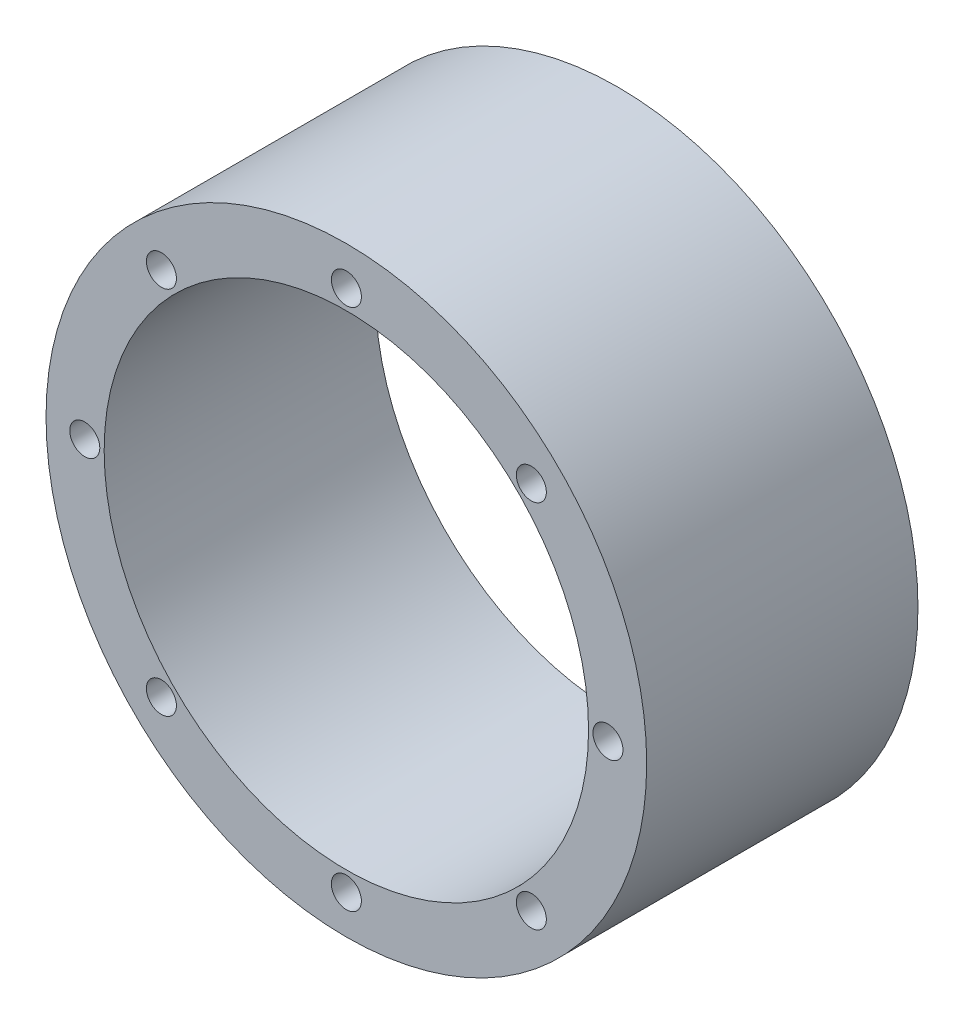
ISO-10303-21;
HEADER;
FILE_DESCRIPTION(('STEP AP214'),'2;1');
FILE_NAME('part.step','',(''),(''),'','','');
FILE_SCHEMA(('AUTOMOTIVE_DESIGN { 1 0 10303 214 1 1 1 1 }'));
ENDSEC;
DATA;
#1=APPLICATION_CONTEXT('core data for automotive mechanical design processes');
#2=APPLICATION_PROTOCOL_DEFINITION('international standard','automotive_design',2000,#1);
#3=PRODUCT_CONTEXT('',#1,'mechanical');
#4=PRODUCT('Part','Part','',(#3));
#5=PRODUCT_RELATED_PRODUCT_CATEGORY('part','',(#4));
#6=PRODUCT_DEFINITION_FORMATION('','',#4);
#7=PRODUCT_DEFINITION_CONTEXT('part definition',#1,'design');
#8=PRODUCT_DEFINITION('design','',#6,#7);
#9=PRODUCT_DEFINITION_SHAPE('','',#8);
#10=(LENGTH_UNIT() NAMED_UNIT(*) SI_UNIT(.MILLI.,.METRE.));
#11=(NAMED_UNIT(*) PLANE_ANGLE_UNIT() SI_UNIT($,.RADIAN.));
#12=(NAMED_UNIT(*) SI_UNIT($,.STERADIAN.) SOLID_ANGLE_UNIT());
#13=UNCERTAINTY_MEASURE_WITH_UNIT(LENGTH_MEASURE(1.E-05),#10,'distance_accuracy_value','');
#14=(GEOMETRIC_REPRESENTATION_CONTEXT(3) GLOBAL_UNCERTAINTY_ASSIGNED_CONTEXT((#13)) GLOBAL_UNIT_ASSIGNED_CONTEXT((#10,
#11,#12)) REPRESENTATION_CONTEXT('',''));
#15=CARTESIAN_POINT('',(0.,0.,0.));
#16=DIRECTION('',(0.,0.,1.));
#17=DIRECTION('',(1.,0.,0.));
#18=AXIS2_PLACEMENT_3D('',#15,#16,#17);
#19=CARTESIAN_POINT('',(0.,0.,28.));
#20=DIRECTION('',(0.,0.,1.));
#21=DIRECTION('',(1.,0.,0.));
#22=AXIS2_PLACEMENT_3D('',#19,#20,#21);
#23=PLANE('',#22);
#24=CARTESIAN_POINT('',(-2.82809988446294E-13,-27.,28.));
#25=DIRECTION('',(0.,0.,1.));
#26=DIRECTION('',(1.,0.,0.));
#27=AXIS2_PLACEMENT_3D('',#24,#25,#26);
#28=CIRCLE('',#27,1.55);
#29=CARTESIAN_POINT('',(1.54999999999971,-27.,28.));
#30=VERTEX_POINT('',#29);
#31=EDGE_CURVE('E86',#30,#30,#28,.T.);
#32=ORIENTED_EDGE('',*,*,#31,.F.);
#33=EDGE_LOOP('',(#32));
#34=FACE_BOUND('',#33,.T.);
#35=CARTESIAN_POINT('',(27.,-1.88539992297529E-13,28.));
#36=DIRECTION('',(0.,0.,1.));
#37=DIRECTION('',(1.,0.,0.));
#38=AXIS2_PLACEMENT_3D('',#35,#36,#37);
#39=CIRCLE('',#38,1.55);
#40=CARTESIAN_POINT('',(28.55,-1.88539992297529E-13,28.));
#41=VERTEX_POINT('',#40);
#42=EDGE_CURVE('E74',#41,#41,#39,.T.);
#43=ORIENTED_EDGE('',*,*,#42,.F.);
#44=EDGE_LOOP('',(#43));
#45=FACE_BOUND('',#44,.T.);
#46=CARTESIAN_POINT('',(0.,27.,28.));
#47=DIRECTION('',(0.,0.,1.));
#48=DIRECTION('',(1.,0.,0.));
#49=AXIS2_PLACEMENT_3D('',#46,#47,#48);
#50=CIRCLE('',#49,1.55);
#51=CARTESIAN_POINT('',(1.55000000000009,27.,28.));
#52=VERTEX_POINT('',#51);
#53=EDGE_CURVE('E62',#52,#52,#50,.T.);
#54=ORIENTED_EDGE('',*,*,#53,.F.);
#55=EDGE_LOOP('',(#54));
#56=FACE_BOUND('',#55,.T.);
#57=CARTESIAN_POINT('',(0.,0.,28.));
#58=DIRECTION('',(0.,0.,1.));
#59=DIRECTION('',(1.,0.,0.));
#60=AXIS2_PLACEMENT_3D('',#57,#58,#59);
#61=CIRCLE('',#60,25.);
#62=CARTESIAN_POINT('',(25.,0.,28.));
#63=VERTEX_POINT('',#62);
#64=EDGE_CURVE('E50',#63,#63,#61,.T.);
#65=ORIENTED_EDGE('',*,*,#64,.F.);
#66=EDGE_LOOP('',(#65));
#67=FACE_BOUND('',#66,.T.);
#68=CARTESIAN_POINT('',(0.,0.,28.));
#69=DIRECTION('',(0.,0.,1.));
#70=DIRECTION('',(1.,0.,0.));
#71=AXIS2_PLACEMENT_3D('',#68,#69,#70);
#72=CIRCLE('',#71,31.);
#73=CARTESIAN_POINT('',(31.,0.,28.));
#74=VERTEX_POINT('',#73);
#75=EDGE_CURVE('E10',#74,#74,#72,.T.);
#76=ORIENTED_EDGE('',*,*,#75,.T.);
#77=EDGE_LOOP('',(#76));
#78=FACE_BOUND('',#77,.T.);
#79=CARTESIAN_POINT('',(-27.,0.,28.));
#80=DIRECTION('',(0.,0.,1.));
#81=DIRECTION('',(1.,0.,0.));
#82=AXIS2_PLACEMENT_3D('',#79,#80,#81);
#83=CIRCLE('',#82,1.55);
#84=CARTESIAN_POINT('',(-25.45,0.,28.));
#85=VERTEX_POINT('',#84);
#86=EDGE_CURVE('E45',#85,#85,#83,.T.);
#87=ORIENTED_EDGE('',*,*,#86,.F.);
#88=EDGE_LOOP('',(#87));
#89=FACE_BOUND('',#88,.T.);
#90=CARTESIAN_POINT('',(-19.0918830920367,19.0918830920368,28.));
#91=DIRECTION('',(0.,0.,1.));
#92=DIRECTION('',(1.,0.,0.));
#93=AXIS2_PLACEMENT_3D('',#90,#91,#92);
#94=CIRCLE('',#93,1.54999999999999);
#95=CARTESIAN_POINT('',(-17.5418830920368,19.0918830920368,28.));
#96=VERTEX_POINT('',#95);
#97=EDGE_CURVE('E56',#96,#96,#94,.T.);
#98=ORIENTED_EDGE('',*,*,#97,.F.);
#99=EDGE_LOOP('',(#98));
#100=FACE_BOUND('',#99,.T.);
#101=CARTESIAN_POINT('',(19.0918830920369,19.0918830920367,28.));
#102=DIRECTION('',(0.,0.,1.));
#103=DIRECTION('',(1.,0.,0.));
#104=AXIS2_PLACEMENT_3D('',#101,#102,#103);
#105=CIRCLE('',#104,1.55);
#106=CARTESIAN_POINT('',(20.6418830920369,19.0918830920367,28.));
#107=VERTEX_POINT('',#106);
#108=EDGE_CURVE('E68',#107,#107,#105,.T.);
#109=ORIENTED_EDGE('',*,*,#108,.F.);
#110=EDGE_LOOP('',(#109));
#111=FACE_BOUND('',#110,.T.);
#112=CARTESIAN_POINT('',(19.0918830920366,-19.0918830920369,28.));
#113=DIRECTION('',(0.,0.,1.));
#114=DIRECTION('',(1.,0.,0.));
#115=AXIS2_PLACEMENT_3D('',#112,#113,#114);
#116=CIRCLE('',#115,1.54999999999999);
#117=CARTESIAN_POINT('',(20.6418830920366,-19.0918830920369,28.));
#118=VERTEX_POINT('',#117);
#119=EDGE_CURVE('E80',#118,#118,#116,.T.);
#120=ORIENTED_EDGE('',*,*,#119,.F.);
#121=EDGE_LOOP('',(#120));
#122=FACE_BOUND('',#121,.T.);
#123=CARTESIAN_POINT('',(-19.091883092037,-19.0918830920366,28.));
#124=DIRECTION('',(0.,0.,1.));
#125=DIRECTION('',(1.,0.,0.));
#126=AXIS2_PLACEMENT_3D('',#123,#124,#125);
#127=CIRCLE('',#126,1.55);
#128=CARTESIAN_POINT('',(-17.541883092037,-19.0918830920366,28.));
#129=VERTEX_POINT('',#128);
#130=EDGE_CURVE('E92',#129,#129,#127,.T.);
#131=ORIENTED_EDGE('',*,*,#130,.F.);
#132=EDGE_LOOP('',(#131));
#133=FACE_BOUND('',#132,.T.);
#134=ADVANCED_FACE('F34',(#34,#45,#56,#67,#78,#89,#100,#111,#122,#133),#23,.T.);
#135=CARTESIAN_POINT('',(0.,0.,0.));
#136=DIRECTION('',(0.,0.,1.));
#137=DIRECTION('',(1.,0.,0.));
#138=AXIS2_PLACEMENT_3D('',#135,#136,#137);
#139=PLANE('',#138);
#140=CARTESIAN_POINT('',(0.,0.,0.));
#141=DIRECTION('',(0.,0.,1.));
#142=DIRECTION('',(1.,0.,0.));
#143=AXIS2_PLACEMENT_3D('',#140,#141,#142);
#144=CIRCLE('',#143,31.);
#145=CARTESIAN_POINT('',(31.,0.,0.));
#146=VERTEX_POINT('',#145);
#147=EDGE_CURVE('E38',#146,#146,#144,.T.);
#148=ORIENTED_EDGE('',*,*,#147,.F.);
#149=EDGE_LOOP('',(#148));
#150=FACE_BOUND('',#149,.T.);
#151=CARTESIAN_POINT('',(-27.,0.,0.));
#152=DIRECTION('',(0.,0.,1.));
#153=DIRECTION('',(1.,0.,0.));
#154=AXIS2_PLACEMENT_3D('',#151,#152,#153);
#155=CIRCLE('',#154,1.55);
#156=CARTESIAN_POINT('',(-25.45,0.,0.));
#157=VERTEX_POINT('',#156);
#158=EDGE_CURVE('E47',#157,#157,#155,.T.);
#159=ORIENTED_EDGE('',*,*,#158,.T.);
#160=EDGE_LOOP('',(#159));
#161=FACE_BOUND('',#160,.T.);
#162=CARTESIAN_POINT('',(0.,0.,0.));
#163=DIRECTION('',(0.,0.,1.));
#164=DIRECTION('',(1.,0.,0.));
#165=AXIS2_PLACEMENT_3D('',#162,#163,#164);
#166=CIRCLE('',#165,25.);
#167=CARTESIAN_POINT('',(25.,0.,0.));
#168=VERTEX_POINT('',#167);
#169=EDGE_CURVE('E53',#168,#168,#166,.T.);
#170=ORIENTED_EDGE('',*,*,#169,.T.);
#171=EDGE_LOOP('',(#170));
#172=FACE_BOUND('',#171,.T.);
#173=CARTESIAN_POINT('',(-19.0918830920367,19.0918830920368,0.));
#174=DIRECTION('',(0.,0.,1.));
#175=DIRECTION('',(1.,0.,0.));
#176=AXIS2_PLACEMENT_3D('',#173,#174,#175);
#177=CIRCLE('',#176,1.54999999999999);
#178=CARTESIAN_POINT('',(-17.5418830920368,19.0918830920368,0.));
#179=VERTEX_POINT('',#178);
#180=EDGE_CURVE('E59',#179,#179,#177,.T.);
#181=ORIENTED_EDGE('',*,*,#180,.T.);
#182=EDGE_LOOP('',(#181));
#183=FACE_BOUND('',#182,.T.);
#184=CARTESIAN_POINT('',(0.,27.,0.));
#185=DIRECTION('',(0.,0.,1.));
#186=DIRECTION('',(1.,0.,0.));
#187=AXIS2_PLACEMENT_3D('',#184,#185,#186);
#188=CIRCLE('',#187,1.55);
#189=CARTESIAN_POINT('',(1.55000000000009,27.,0.));
#190=VERTEX_POINT('',#189);
#191=EDGE_CURVE('E65',#190,#190,#188,.T.);
#192=ORIENTED_EDGE('',*,*,#191,.T.);
#193=EDGE_LOOP('',(#192));
#194=FACE_BOUND('',#193,.T.);
#195=CARTESIAN_POINT('',(19.0918830920369,19.0918830920367,0.));
#196=DIRECTION('',(0.,0.,1.));
#197=DIRECTION('',(1.,0.,0.));
#198=AXIS2_PLACEMENT_3D('',#195,#196,#197);
#199=CIRCLE('',#198,1.55);
#200=CARTESIAN_POINT('',(20.6418830920369,19.0918830920367,0.));
#201=VERTEX_POINT('',#200);
#202=EDGE_CURVE('E71',#201,#201,#199,.T.);
#203=ORIENTED_EDGE('',*,*,#202,.T.);
#204=EDGE_LOOP('',(#203));
#205=FACE_BOUND('',#204,.T.);
#206=CARTESIAN_POINT('',(27.,-1.88539992297529E-13,0.));
#207=DIRECTION('',(0.,0.,1.));
#208=DIRECTION('',(1.,0.,0.));
#209=AXIS2_PLACEMENT_3D('',#206,#207,#208);
#210=CIRCLE('',#209,1.55);
#211=CARTESIAN_POINT('',(28.55,-1.88539992297529E-13,0.));
#212=VERTEX_POINT('',#211);
#213=EDGE_CURVE('E77',#212,#212,#210,.T.);
#214=ORIENTED_EDGE('',*,*,#213,.T.);
#215=EDGE_LOOP('',(#214));
#216=FACE_BOUND('',#215,.T.);
#217=CARTESIAN_POINT('',(19.0918830920366,-19.0918830920369,0.));
#218=DIRECTION('',(0.,0.,1.));
#219=DIRECTION('',(1.,0.,0.));
#220=AXIS2_PLACEMENT_3D('',#217,#218,#219);
#221=CIRCLE('',#220,1.54999999999999);
#222=CARTESIAN_POINT('',(20.6418830920366,-19.0918830920369,0.));
#223=VERTEX_POINT('',#222);
#224=EDGE_CURVE('E83',#223,#223,#221,.T.);
#225=ORIENTED_EDGE('',*,*,#224,.T.);
#226=EDGE_LOOP('',(#225));
#227=FACE_BOUND('',#226,.T.);
#228=CARTESIAN_POINT('',(-2.82809988446294E-13,-27.,0.));
#229=DIRECTION('',(0.,0.,1.));
#230=DIRECTION('',(1.,0.,0.));
#231=AXIS2_PLACEMENT_3D('',#228,#229,#230);
#232=CIRCLE('',#231,1.55);
#233=CARTESIAN_POINT('',(1.54999999999971,-27.,0.));
#234=VERTEX_POINT('',#233);
#235=EDGE_CURVE('E89',#234,#234,#232,.T.);
#236=ORIENTED_EDGE('',*,*,#235,.T.);
#237=EDGE_LOOP('',(#236));
#238=FACE_BOUND('',#237,.T.);
#239=CARTESIAN_POINT('',(-19.091883092037,-19.0918830920366,0.));
#240=DIRECTION('',(0.,0.,1.));
#241=DIRECTION('',(1.,0.,0.));
#242=AXIS2_PLACEMENT_3D('',#239,#240,#241);
#243=CIRCLE('',#242,1.55);
#244=CARTESIAN_POINT('',(-17.541883092037,-19.0918830920366,0.));
#245=VERTEX_POINT('',#244);
#246=EDGE_CURVE('E95',#245,#245,#243,.T.);
#247=ORIENTED_EDGE('',*,*,#246,.T.);
#248=EDGE_LOOP('',(#247));
#249=FACE_BOUND('',#248,.T.);
#250=ADVANCED_FACE('F105',(#150,#161,#172,#183,#194,#205,#216,#227,#238,#249),#139,.F.);
#251=CARTESIAN_POINT('',(0.,0.,28.));
#252=DIRECTION('',(0.,0.,-1.));
#253=DIRECTION('',(-1.,0.,0.));
#254=AXIS2_PLACEMENT_3D('',#251,#252,#253);
#255=CYLINDRICAL_SURFACE('',#254,31.);
#256=ORIENTED_EDGE('',*,*,#75,.F.);
#257=EDGE_LOOP('',(#256));
#258=FACE_BOUND('',#257,.T.);
#259=ORIENTED_EDGE('',*,*,#147,.T.);
#260=EDGE_LOOP('',(#259));
#261=FACE_BOUND('',#260,.T.);
#262=ADVANCED_FACE('F36',(#258,#261),#255,.T.);
#263=CARTESIAN_POINT('',(-27.,0.,28.));
#264=DIRECTION('',(0.,0.,-1.));
#265=DIRECTION('',(-1.,0.,0.));
#266=AXIS2_PLACEMENT_3D('',#263,#264,#265);
#267=CYLINDRICAL_SURFACE('',#266,1.55);
#268=ORIENTED_EDGE('',*,*,#86,.T.);
#269=EDGE_LOOP('',(#268));
#270=FACE_BOUND('',#269,.T.);
#271=ORIENTED_EDGE('',*,*,#158,.F.);
#272=EDGE_LOOP('',(#271));
#273=FACE_BOUND('',#272,.T.);
#274=ADVANCED_FACE('F115',(#270,#273),#267,.F.);
#275=CARTESIAN_POINT('',(0.,0.,28.));
#276=DIRECTION('',(0.,0.,-1.));
#277=DIRECTION('',(-1.,0.,0.));
#278=AXIS2_PLACEMENT_3D('',#275,#276,#277);
#279=CYLINDRICAL_SURFACE('',#278,25.);
#280=ORIENTED_EDGE('',*,*,#64,.T.);
#281=EDGE_LOOP('',(#280));
#282=FACE_BOUND('',#281,.T.);
#283=ORIENTED_EDGE('',*,*,#169,.F.);
#284=EDGE_LOOP('',(#283));
#285=FACE_BOUND('',#284,.T.);
#286=ADVANCED_FACE('F118',(#282,#285),#279,.F.);
#287=CARTESIAN_POINT('',(-19.0918830920367,19.0918830920368,28.));
#288=DIRECTION('',(0.,0.,-1.));
#289=DIRECTION('',(-1.,0.,0.));
#290=AXIS2_PLACEMENT_3D('',#287,#288,#289);
#291=CYLINDRICAL_SURFACE('',#290,1.54999999999999);
#292=ORIENTED_EDGE('',*,*,#97,.T.);
#293=EDGE_LOOP('',(#292));
#294=FACE_BOUND('',#293,.T.);
#295=ORIENTED_EDGE('',*,*,#180,.F.);
#296=EDGE_LOOP('',(#295));
#297=FACE_BOUND('',#296,.T.);
#298=ADVANCED_FACE('F122',(#294,#297),#291,.F.);
#299=CARTESIAN_POINT('',(0.,27.,28.));
#300=DIRECTION('',(0.,0.,-1.));
#301=DIRECTION('',(-1.,0.,0.));
#302=AXIS2_PLACEMENT_3D('',#299,#300,#301);
#303=CYLINDRICAL_SURFACE('',#302,1.55);
#304=ORIENTED_EDGE('',*,*,#53,.T.);
#305=EDGE_LOOP('',(#304));
#306=FACE_BOUND('',#305,.T.);
#307=ORIENTED_EDGE('',*,*,#191,.F.);
#308=EDGE_LOOP('',(#307));
#309=FACE_BOUND('',#308,.T.);
#310=ADVANCED_FACE('F126',(#306,#309),#303,.F.);
#311=CARTESIAN_POINT('',(19.0918830920369,19.0918830920367,28.));
#312=DIRECTION('',(0.,0.,-1.));
#313=DIRECTION('',(-1.,0.,0.));
#314=AXIS2_PLACEMENT_3D('',#311,#312,#313);
#315=CYLINDRICAL_SURFACE('',#314,1.55);
#316=ORIENTED_EDGE('',*,*,#108,.T.);
#317=EDGE_LOOP('',(#316));
#318=FACE_BOUND('',#317,.T.);
#319=ORIENTED_EDGE('',*,*,#202,.F.);
#320=EDGE_LOOP('',(#319));
#321=FACE_BOUND('',#320,.T.);
#322=ADVANCED_FACE('F130',(#318,#321),#315,.F.);
#323=CARTESIAN_POINT('',(27.,-1.88539992297529E-13,28.));
#324=DIRECTION('',(0.,0.,-1.));
#325=DIRECTION('',(-1.,0.,0.));
#326=AXIS2_PLACEMENT_3D('',#323,#324,#325);
#327=CYLINDRICAL_SURFACE('',#326,1.55);
#328=ORIENTED_EDGE('',*,*,#42,.T.);
#329=EDGE_LOOP('',(#328));
#330=FACE_BOUND('',#329,.T.);
#331=ORIENTED_EDGE('',*,*,#213,.F.);
#332=EDGE_LOOP('',(#331));
#333=FACE_BOUND('',#332,.T.);
#334=ADVANCED_FACE('F134',(#330,#333),#327,.F.);
#335=CARTESIAN_POINT('',(19.0918830920366,-19.0918830920369,28.));
#336=DIRECTION('',(0.,0.,-1.));
#337=DIRECTION('',(-1.,0.,0.));
#338=AXIS2_PLACEMENT_3D('',#335,#336,#337);
#339=CYLINDRICAL_SURFACE('',#338,1.54999999999999);
#340=ORIENTED_EDGE('',*,*,#119,.T.);
#341=EDGE_LOOP('',(#340));
#342=FACE_BOUND('',#341,.T.);
#343=ORIENTED_EDGE('',*,*,#224,.F.);
#344=EDGE_LOOP('',(#343));
#345=FACE_BOUND('',#344,.T.);
#346=ADVANCED_FACE('F138',(#342,#345),#339,.F.);
#347=CARTESIAN_POINT('',(-2.82809988446294E-13,-27.,28.));
#348=DIRECTION('',(0.,0.,-1.));
#349=DIRECTION('',(-1.,0.,0.));
#350=AXIS2_PLACEMENT_3D('',#347,#348,#349);
#351=CYLINDRICAL_SURFACE('',#350,1.55);
#352=ORIENTED_EDGE('',*,*,#31,.T.);
#353=EDGE_LOOP('',(#352));
#354=FACE_BOUND('',#353,.T.);
#355=ORIENTED_EDGE('',*,*,#235,.F.);
#356=EDGE_LOOP('',(#355));
#357=FACE_BOUND('',#356,.T.);
#358=ADVANCED_FACE('F142',(#354,#357),#351,.F.);
#359=CARTESIAN_POINT('',(-19.091883092037,-19.0918830920366,28.));
#360=DIRECTION('',(0.,0.,-1.));
#361=DIRECTION('',(-1.,0.,0.));
#362=AXIS2_PLACEMENT_3D('',#359,#360,#361);
#363=CYLINDRICAL_SURFACE('',#362,1.55);
#364=ORIENTED_EDGE('',*,*,#130,.T.);
#365=EDGE_LOOP('',(#364));
#366=FACE_BOUND('',#365,.T.);
#367=ORIENTED_EDGE('',*,*,#246,.F.);
#368=EDGE_LOOP('',(#367));
#369=FACE_BOUND('',#368,.T.);
#370=ADVANCED_FACE('F101',(#366,#369),#363,.F.);
#371=CLOSED_SHELL('',(#134,#250,#262,#274,#286,#298,#310,#322,#334,#346,#358,#370));
#372=MANIFOLD_SOLID_BREP('B2',#371);
#373=ADVANCED_BREP_SHAPE_REPRESENTATION('',(#18,#372),#14);
#374=SHAPE_DEFINITION_REPRESENTATION(#9,#373);
ENDSEC;
END-ISO-10303-21;
